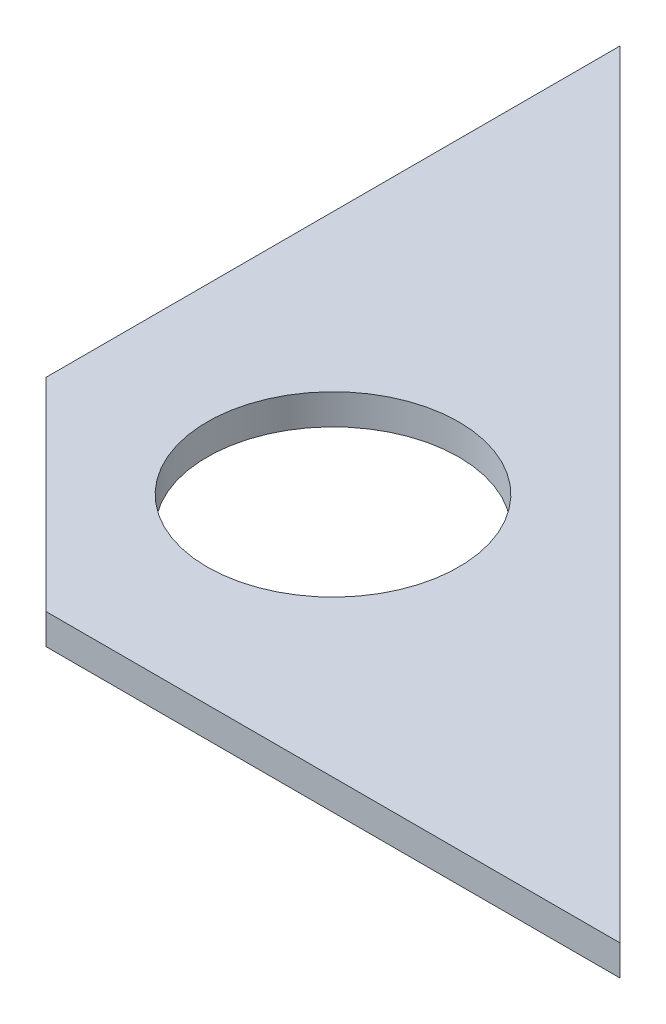
ISO-10303-21;
HEADER;
FILE_DESCRIPTION(('STEP AP214'),'2;1');
FILE_NAME('part.step','',(''),(''),'','','');
FILE_SCHEMA(('AUTOMOTIVE_DESIGN { 1 0 10303 214 1 1 1 1 }'));
ENDSEC;
DATA;
#1=APPLICATION_CONTEXT('core data for automotive mechanical design processes');
#2=APPLICATION_PROTOCOL_DEFINITION('international standard','automotive_design',2000,#1);
#3=PRODUCT_CONTEXT('',#1,'mechanical');
#4=PRODUCT('Part','Part','',(#3));
#5=PRODUCT_RELATED_PRODUCT_CATEGORY('part','',(#4));
#6=PRODUCT_DEFINITION_FORMATION('','',#4);
#7=PRODUCT_DEFINITION_CONTEXT('part definition',#1,'design');
#8=PRODUCT_DEFINITION('design','',#6,#7);
#9=PRODUCT_DEFINITION_SHAPE('','',#8);
#10=(LENGTH_UNIT() NAMED_UNIT(*) SI_UNIT(.MILLI.,.METRE.));
#11=(NAMED_UNIT(*) PLANE_ANGLE_UNIT() SI_UNIT($,.RADIAN.));
#12=(NAMED_UNIT(*) SI_UNIT($,.STERADIAN.) SOLID_ANGLE_UNIT());
#13=UNCERTAINTY_MEASURE_WITH_UNIT(LENGTH_MEASURE(1.E-05),#10,'distance_accuracy_value','');
#14=(GEOMETRIC_REPRESENTATION_CONTEXT(3) GLOBAL_UNCERTAINTY_ASSIGNED_CONTEXT((#13)) GLOBAL_UNIT_ASSIGNED_CONTEXT((#10,
#11,#12)) REPRESENTATION_CONTEXT('',''));
#15=CARTESIAN_POINT('',(0.,0.,0.));
#16=DIRECTION('',(0.,0.,1.));
#17=DIRECTION('',(1.,0.,0.));
#18=AXIS2_PLACEMENT_3D('',#15,#16,#17);
#19=CARTESIAN_POINT('',(0.,3.,0.));
#20=DIRECTION('',(0.,1.,0.));
#21=DIRECTION('',(0.,0.,1.));
#22=AXIS2_PLACEMENT_3D('',#19,#20,#21);
#23=PLANE('',#22);
#24=DIRECTION('',(-0.707106781186548,0.,-0.707106781186547));
#25=VECTOR('',#24,1.);
#26=CARTESIAN_POINT('',(76.5685424949238,3.,0.));
#27=LINE('',#26,#25);
#28=CARTESIAN_POINT('',(76.5685424949238,3.,0.));
#29=VERTEX_POINT('',#28);
#30=CARTESIAN_POINT('',(0.,3.,-76.5685424949238));
#31=VERTEX_POINT('',#30);
#32=EDGE_CURVE('E92',#29,#31,#27,.T.);
#33=ORIENTED_EDGE('',*,*,#32,.T.);
#34=DIRECTION('',(0.,0.,1.));
#35=VECTOR('',#34,1.);
#36=CARTESIAN_POINT('',(0.,3.,-76.5685424949238));
#37=LINE('',#36,#35);
#38=CARTESIAN_POINT('',(0.,3.,-20.));
#39=VERTEX_POINT('',#38);
#40=EDGE_CURVE('E87',#31,#39,#37,.T.);
#41=ORIENTED_EDGE('',*,*,#40,.T.);
#42=DIRECTION('',(0.707106781186547,0.,0.707106781186548));
#43=VECTOR('',#42,1.);
#44=CARTESIAN_POINT('',(0.,3.,-20.));
#45=LINE('',#44,#43);
#46=CARTESIAN_POINT('',(20.,3.,0.));
#47=VERTEX_POINT('',#46);
#48=EDGE_CURVE('E90',#39,#47,#45,.T.);
#49=ORIENTED_EDGE('',*,*,#48,.T.);
#50=DIRECTION('',(1.,0.,0.));
#51=VECTOR('',#50,1.);
#52=CARTESIAN_POINT('',(20.,3.,0.));
#53=LINE('',#52,#51);
#54=EDGE_CURVE('E57',#47,#29,#53,.T.);
#55=ORIENTED_EDGE('',*,*,#54,.T.);
#56=EDGE_LOOP('',(#33,#41,#49,#55));
#57=FACE_BOUND('',#56,.T.);
#58=CARTESIAN_POINT('',(24.142135623731,3.,-24.142135623731));
#59=DIRECTION('',(0.,1.,0.));
#60=DIRECTION('',(0.,0.,1.));
#61=AXIS2_PLACEMENT_3D('',#58,#59,#60);
#62=CIRCLE('',#61,12.4);
#63=CARTESIAN_POINT('',(24.142135623731,3.,-11.742135623731));
#64=VERTEX_POINT('',#63);
#65=EDGE_CURVE('E112',#64,#64,#62,.T.);
#66=ORIENTED_EDGE('',*,*,#65,.F.);
#67=EDGE_LOOP('',(#66));
#68=FACE_BOUND('',#67,.T.);
#69=ADVANCED_FACE('F39',(#57,#68),#23,.T.);
#70=CARTESIAN_POINT('',(0.,0.,0.));
#71=DIRECTION('',(0.,1.,0.));
#72=DIRECTION('',(0.,0.,1.));
#73=AXIS2_PLACEMENT_3D('',#70,#71,#72);
#74=PLANE('',#73);
#75=DIRECTION('',(-0.707106781186548,0.,-0.707106781186547));
#76=VECTOR('',#75,1.);
#77=CARTESIAN_POINT('',(76.5685424949238,0.,0.));
#78=LINE('',#77,#76);
#79=CARTESIAN_POINT('',(76.5685424949238,0.,0.));
#80=VERTEX_POINT('',#79);
#81=CARTESIAN_POINT('',(0.,0.,-76.5685424949238));
#82=VERTEX_POINT('',#81);
#83=EDGE_CURVE('E108',#80,#82,#78,.T.);
#84=ORIENTED_EDGE('',*,*,#83,.F.);
#85=DIRECTION('',(1.,0.,0.));
#86=VECTOR('',#85,1.);
#87=CARTESIAN_POINT('',(20.,0.,0.));
#88=LINE('',#87,#86);
#89=CARTESIAN_POINT('',(20.,0.,0.));
#90=VERTEX_POINT('',#89);
#91=EDGE_CURVE('E80',#90,#80,#88,.T.);
#92=ORIENTED_EDGE('',*,*,#91,.F.);
#93=DIRECTION('',(0.707106781186547,0.,0.707106781186548));
#94=VECTOR('',#93,1.);
#95=CARTESIAN_POINT('',(0.,0.,-20.));
#96=LINE('',#95,#94);
#97=CARTESIAN_POINT('',(0.,0.,-20.));
#98=VERTEX_POINT('',#97);
#99=EDGE_CURVE('E74',#98,#90,#96,.T.);
#100=ORIENTED_EDGE('',*,*,#99,.F.);
#101=DIRECTION('',(0.,0.,1.));
#102=VECTOR('',#101,1.);
#103=CARTESIAN_POINT('',(0.,0.,-76.5685424949238));
#104=LINE('',#103,#102);
#105=EDGE_CURVE('E97',#82,#98,#104,.T.);
#106=ORIENTED_EDGE('',*,*,#105,.F.);
#107=EDGE_LOOP('',(#84,#92,#100,#106));
#108=FACE_BOUND('',#107,.T.);
#109=CARTESIAN_POINT('',(24.142135623731,0.,-24.142135623731));
#110=DIRECTION('',(0.,1.,0.));
#111=DIRECTION('',(0.,0.,1.));
#112=AXIS2_PLACEMENT_3D('',#109,#110,#111);
#113=CIRCLE('',#112,12.4);
#114=CARTESIAN_POINT('',(24.142135623731,0.,-11.742135623731));
#115=VERTEX_POINT('',#114);
#116=EDGE_CURVE('E130',#115,#115,#113,.T.);
#117=ORIENTED_EDGE('',*,*,#116,.T.);
#118=EDGE_LOOP('',(#117));
#119=FACE_BOUND('',#118,.T.);
#120=ADVANCED_FACE('F125',(#108,#119),#74,.F.);
#121=CARTESIAN_POINT('',(76.5685424949238,3.,0.));
#122=DIRECTION('',(-0.707106781186547,0.,0.707106781186548));
#123=DIRECTION('',(0.707106781186548,0.,0.707106781186547));
#124=AXIS2_PLACEMENT_3D('',#121,#122,#123);
#125=PLANE('',#124);
#126=ORIENTED_EDGE('',*,*,#83,.T.);
#127=DIRECTION('',(0.,-1.,0.));
#128=VECTOR('',#127,1.);
#129=CARTESIAN_POINT('',(0.,3.,-76.5685424949238));
#130=LINE('',#129,#128);
#131=EDGE_CURVE('E11',#31,#82,#130,.T.);
#132=ORIENTED_EDGE('',*,*,#131,.F.);
#133=ORIENTED_EDGE('',*,*,#32,.F.);
#134=DIRECTION('',(0.,-1.,0.));
#135=VECTOR('',#134,1.);
#136=CARTESIAN_POINT('',(76.5685424949238,3.,0.));
#137=LINE('',#136,#135);
#138=EDGE_CURVE('E104',#29,#80,#137,.T.);
#139=ORIENTED_EDGE('',*,*,#138,.T.);
#140=EDGE_LOOP('',(#126,#132,#133,#139));
#141=FACE_BOUND('',#140,.T.);
#142=ADVANCED_FACE('F41',(#141),#125,.F.);
#143=CARTESIAN_POINT('',(0.,3.,-76.5685424949238));
#144=DIRECTION('',(1.,0.,0.));
#145=DIRECTION('',(0.,0.,-1.));
#146=AXIS2_PLACEMENT_3D('',#143,#144,#145);
#147=PLANE('',#146);
#148=ORIENTED_EDGE('',*,*,#105,.T.);
#149=DIRECTION('',(0.,-1.,0.));
#150=VECTOR('',#149,1.);
#151=CARTESIAN_POINT('',(0.,3.,-20.));
#152=LINE('',#151,#150);
#153=EDGE_CURVE('E49',#39,#98,#152,.T.);
#154=ORIENTED_EDGE('',*,*,#153,.F.);
#155=ORIENTED_EDGE('',*,*,#40,.F.);
#156=ORIENTED_EDGE('',*,*,#131,.T.);
#157=EDGE_LOOP('',(#148,#154,#155,#156));
#158=FACE_BOUND('',#157,.T.);
#159=ADVANCED_FACE('F96',(#158),#147,.F.);
#160=CARTESIAN_POINT('',(0.,3.,-20.));
#161=DIRECTION('',(0.707106781186548,0.,-0.707106781186547));
#162=DIRECTION('',(-0.707106781186547,0.,-0.707106781186548));
#163=AXIS2_PLACEMENT_3D('',#160,#161,#162);
#164=PLANE('',#163);
#165=ORIENTED_EDGE('',*,*,#99,.T.);
#166=DIRECTION('',(0.,-1.,0.));
#167=VECTOR('',#166,1.);
#168=CARTESIAN_POINT('',(20.,3.,0.));
#169=LINE('',#168,#167);
#170=EDGE_CURVE('E99',#47,#90,#169,.T.);
#171=ORIENTED_EDGE('',*,*,#170,.F.);
#172=ORIENTED_EDGE('',*,*,#48,.F.);
#173=ORIENTED_EDGE('',*,*,#153,.T.);
#174=EDGE_LOOP('',(#165,#171,#172,#173));
#175=FACE_BOUND('',#174,.T.);
#176=ADVANCED_FACE('F100',(#175),#164,.F.);
#177=CARTESIAN_POINT('',(20.,3.,0.));
#178=DIRECTION('',(0.,0.,-1.));
#179=DIRECTION('',(-1.,0.,0.));
#180=AXIS2_PLACEMENT_3D('',#177,#178,#179);
#181=PLANE('',#180);
#182=ORIENTED_EDGE('',*,*,#91,.T.);
#183=ORIENTED_EDGE('',*,*,#138,.F.);
#184=ORIENTED_EDGE('',*,*,#54,.F.);
#185=ORIENTED_EDGE('',*,*,#170,.T.);
#186=EDGE_LOOP('',(#182,#183,#184,#185));
#187=FACE_BOUND('',#186,.T.);
#188=ADVANCED_FACE('F122',(#187),#181,.F.);
#189=CARTESIAN_POINT('',(24.142135623731,3.,-24.142135623731));
#190=DIRECTION('',(0.,-1.,0.));
#191=DIRECTION('',(0.,0.,-1.));
#192=AXIS2_PLACEMENT_3D('',#189,#190,#191);
#193=CYLINDRICAL_SURFACE('',#192,12.4);
#194=ORIENTED_EDGE('',*,*,#65,.T.);
#195=EDGE_LOOP('',(#194));
#196=FACE_BOUND('',#195,.T.);
#197=ORIENTED_EDGE('',*,*,#116,.F.);
#198=EDGE_LOOP('',(#197));
#199=FACE_BOUND('',#198,.T.);
#200=ADVANCED_FACE('F138',(#196,#199),#193,.F.);
#201=CLOSED_SHELL('',(#69,#120,#142,#159,#176,#188,#200));
#202=MANIFOLD_SOLID_BREP('B2',#201);
#203=ADVANCED_BREP_SHAPE_REPRESENTATION('',(#18,#202),#14);
#204=SHAPE_DEFINITION_REPRESENTATION(#9,#203);
ENDSEC;
END-ISO-10303-21;
